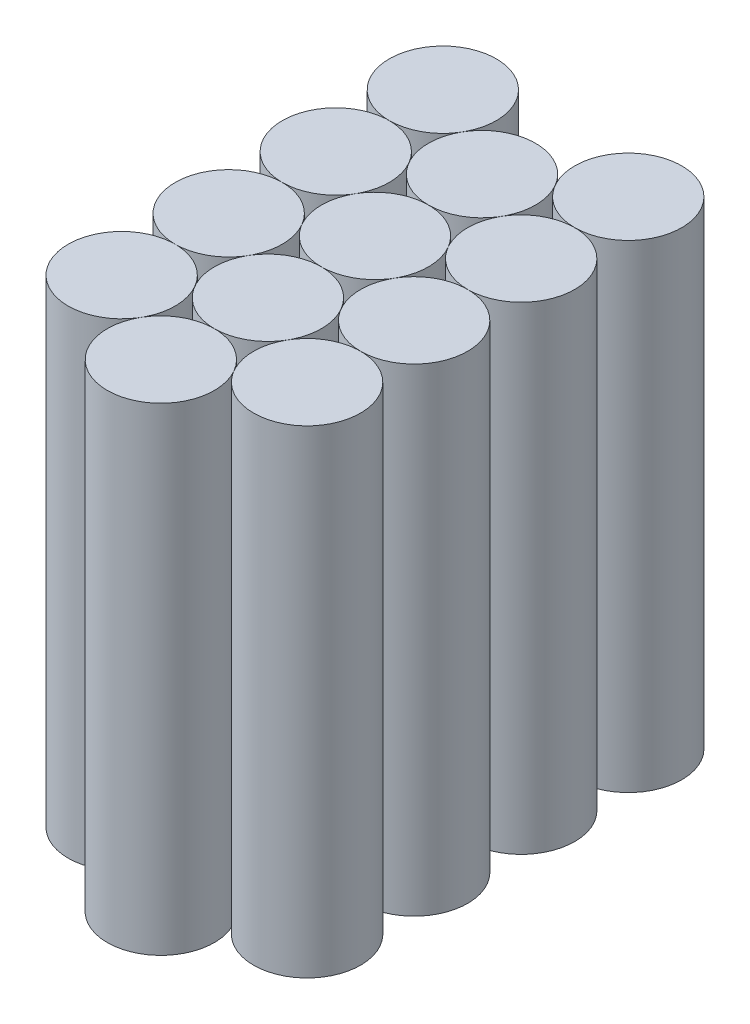
ISO-10303-21;
HEADER;
FILE_DESCRIPTION(('STEP AP214'),'2;1');
FILE_NAME('part.step','',(''),(''),'','','');
FILE_SCHEMA(('AUTOMOTIVE_DESIGN { 1 0 10303 214 1 1 1 1 }'));
ENDSEC;
DATA;
#1=APPLICATION_CONTEXT('core data for automotive mechanical design processes');
#2=APPLICATION_PROTOCOL_DEFINITION('international standard','automotive_design',2000,#1);
#3=PRODUCT_CONTEXT('',#1,'mechanical');
#4=PRODUCT('Part','Part','',(#3));
#5=PRODUCT_RELATED_PRODUCT_CATEGORY('part','',(#4));
#6=PRODUCT_DEFINITION_FORMATION('','',#4);
#7=PRODUCT_DEFINITION_CONTEXT('part definition',#1,'design');
#8=PRODUCT_DEFINITION('design','',#6,#7);
#9=PRODUCT_DEFINITION_SHAPE('','',#8);
#10=(LENGTH_UNIT() NAMED_UNIT(*) SI_UNIT(.MILLI.,.METRE.));
#11=(NAMED_UNIT(*) PLANE_ANGLE_UNIT() SI_UNIT($,.RADIAN.));
#12=(NAMED_UNIT(*) SI_UNIT($,.STERADIAN.) SOLID_ANGLE_UNIT());
#13=UNCERTAINTY_MEASURE_WITH_UNIT(LENGTH_MEASURE(1.E-05),#10,'distance_accuracy_value','');
#14=(GEOMETRIC_REPRESENTATION_CONTEXT(3) GLOBAL_UNCERTAINTY_ASSIGNED_CONTEXT((#13)) GLOBAL_UNIT_ASSIGNED_CONTEXT((#10,
#11,#12)) REPRESENTATION_CONTEXT('',''));
#15=CARTESIAN_POINT('',(0.,0.,0.));
#16=DIRECTION('',(0.,0.,1.));
#17=DIRECTION('',(1.,0.,0.));
#18=AXIS2_PLACEMENT_3D('',#15,#16,#17);
#19=CARTESIAN_POINT('',(12.9903810567666,67.,-22.5));
#20=DIRECTION('',(0.,-1.,0.));
#21=DIRECTION('',(0.,0.,-1.));
#22=AXIS2_PLACEMENT_3D('',#19,#20,#21);
#23=CYLINDRICAL_SURFACE('',#22,7.49999999999999);
#24=CARTESIAN_POINT('',(12.9903810567666,67.,-22.5));
#25=DIRECTION('',(0.,1.,0.));
#26=DIRECTION('',(0.,0.,1.));
#27=AXIS2_PLACEMENT_3D('',#24,#25,#26);
#28=CIRCLE('',#27,7.49999999999999);
#29=CARTESIAN_POINT('',(12.9903810567666,67.,-15.));
#30=VERTEX_POINT('',#29);
#31=EDGE_CURVE('E12',#30,#30,#28,.T.);
#32=ORIENTED_EDGE('',*,*,#31,.F.);
#33=EDGE_LOOP('',(#32));
#34=FACE_BOUND('',#33,.T.);
#35=CARTESIAN_POINT('',(12.9903810567666,0.,-22.5));
#36=DIRECTION('',(0.,1.,0.));
#37=DIRECTION('',(0.,0.,1.));
#38=AXIS2_PLACEMENT_3D('',#35,#36,#37);
#39=CIRCLE('',#38,7.49999999999999);
#40=CARTESIAN_POINT('',(12.9903810567666,0.,-15.));
#41=VERTEX_POINT('',#40);
#42=EDGE_CURVE('E138',#41,#41,#39,.T.);
#43=ORIENTED_EDGE('',*,*,#42,.T.);
#44=EDGE_LOOP('',(#43));
#45=FACE_BOUND('',#44,.T.);
#46=ADVANCED_FACE('F135',(#34,#45),#23,.T.);
#47=CARTESIAN_POINT('',(0.,67.,0.));
#48=DIRECTION('',(0.,1.,0.));
#49=DIRECTION('',(0.,0.,1.));
#50=AXIS2_PLACEMENT_3D('',#47,#48,#49);
#51=PLANE('',#50);
#52=ORIENTED_EDGE('',*,*,#31,.T.);
#53=EDGE_LOOP('',(#52));
#54=FACE_BOUND('',#53,.T.);
#55=ADVANCED_FACE('F150',(#54),#51,.T.);
#56=CARTESIAN_POINT('',(0.,0.,0.));
#57=DIRECTION('',(0.,1.,0.));
#58=DIRECTION('',(0.,0.,1.));
#59=AXIS2_PLACEMENT_3D('',#56,#57,#58);
#60=PLANE('',#59);
#61=ORIENTED_EDGE('',*,*,#42,.F.);
#62=EDGE_LOOP('',(#61));
#63=FACE_BOUND('',#62,.T.);
#64=ADVANCED_FACE('F148',(#63),#60,.F.);
#65=CLOSED_SHELL('',(#46,#55,#64));
#66=MANIFOLD_SOLID_BREP('B2',#65);
#67=CARTESIAN_POINT('',(12.9903810567666,67.,-37.5));
#68=DIRECTION('',(0.,-1.,0.));
#69=DIRECTION('',(0.,0.,-1.));
#70=AXIS2_PLACEMENT_3D('',#67,#68,#69);
#71=CYLINDRICAL_SURFACE('',#70,7.5);
#72=CARTESIAN_POINT('',(12.9903810567666,67.,-37.5));
#73=DIRECTION('',(0.,1.,0.));
#74=DIRECTION('',(0.,0.,1.));
#75=AXIS2_PLACEMENT_3D('',#72,#73,#74);
#76=CIRCLE('',#75,7.5);
#77=CARTESIAN_POINT('',(12.9903810567666,67.,-30.));
#78=VERTEX_POINT('',#77);
#79=EDGE_CURVE('E134',#78,#78,#76,.T.);
#80=ORIENTED_EDGE('',*,*,#79,.F.);
#81=EDGE_LOOP('',(#80));
#82=FACE_BOUND('',#81,.T.);
#83=CARTESIAN_POINT('',(12.9903810567666,0.,-37.5));
#84=DIRECTION('',(0.,1.,0.));
#85=DIRECTION('',(0.,0.,1.));
#86=AXIS2_PLACEMENT_3D('',#83,#84,#85);
#87=CIRCLE('',#86,7.5);
#88=CARTESIAN_POINT('',(12.9903810567666,0.,-30.));
#89=VERTEX_POINT('',#88);
#90=EDGE_CURVE('E186',#89,#89,#87,.T.);
#91=ORIENTED_EDGE('',*,*,#90,.T.);
#92=EDGE_LOOP('',(#91));
#93=FACE_BOUND('',#92,.T.);
#94=ADVANCED_FACE('F183',(#82,#93),#71,.T.);
#95=CARTESIAN_POINT('',(0.,67.,0.));
#96=DIRECTION('',(0.,1.,0.));
#97=DIRECTION('',(0.,0.,1.));
#98=AXIS2_PLACEMENT_3D('',#95,#96,#97);
#99=PLANE('',#98);
#100=ORIENTED_EDGE('',*,*,#79,.T.);
#101=EDGE_LOOP('',(#100));
#102=FACE_BOUND('',#101,.T.);
#103=ADVANCED_FACE('F198',(#102),#99,.T.);
#104=CARTESIAN_POINT('',(0.,0.,0.));
#105=DIRECTION('',(0.,1.,0.));
#106=DIRECTION('',(0.,0.,1.));
#107=AXIS2_PLACEMENT_3D('',#104,#105,#106);
#108=PLANE('',#107);
#109=ORIENTED_EDGE('',*,*,#90,.F.);
#110=EDGE_LOOP('',(#109));
#111=FACE_BOUND('',#110,.T.);
#112=ADVANCED_FACE('F196',(#111),#108,.F.);
#113=CLOSED_SHELL('',(#94,#103,#112));
#114=MANIFOLD_SOLID_BREP('B7',#113);
#115=CARTESIAN_POINT('',(12.9903810567666,67.,-52.5));
#116=DIRECTION('',(0.,-1.,0.));
#117=DIRECTION('',(0.,0.,-1.));
#118=AXIS2_PLACEMENT_3D('',#115,#116,#117);
#119=CYLINDRICAL_SURFACE('',#118,7.49999999999999);
#120=CARTESIAN_POINT('',(12.9903810567666,67.,-52.5));
#121=DIRECTION('',(0.,1.,0.));
#122=DIRECTION('',(0.,0.,1.));
#123=AXIS2_PLACEMENT_3D('',#120,#121,#122);
#124=CIRCLE('',#123,7.49999999999999);
#125=CARTESIAN_POINT('',(12.9903810567666,67.,-45.));
#126=VERTEX_POINT('',#125);
#127=EDGE_CURVE('E182',#126,#126,#124,.T.);
#128=ORIENTED_EDGE('',*,*,#127,.F.);
#129=EDGE_LOOP('',(#128));
#130=FACE_BOUND('',#129,.T.);
#131=CARTESIAN_POINT('',(12.9903810567666,0.,-52.5));
#132=DIRECTION('',(0.,1.,0.));
#133=DIRECTION('',(0.,0.,1.));
#134=AXIS2_PLACEMENT_3D('',#131,#132,#133);
#135=CIRCLE('',#134,7.49999999999999);
#136=CARTESIAN_POINT('',(12.9903810567666,0.,-45.));
#137=VERTEX_POINT('',#136);
#138=EDGE_CURVE('E234',#137,#137,#135,.T.);
#139=ORIENTED_EDGE('',*,*,#138,.T.);
#140=EDGE_LOOP('',(#139));
#141=FACE_BOUND('',#140,.T.);
#142=ADVANCED_FACE('F231',(#130,#141),#119,.T.);
#143=CARTESIAN_POINT('',(0.,67.,0.));
#144=DIRECTION('',(0.,1.,0.));
#145=DIRECTION('',(0.,0.,1.));
#146=AXIS2_PLACEMENT_3D('',#143,#144,#145);
#147=PLANE('',#146);
#148=ORIENTED_EDGE('',*,*,#127,.T.);
#149=EDGE_LOOP('',(#148));
#150=FACE_BOUND('',#149,.T.);
#151=ADVANCED_FACE('F246',(#150),#147,.T.);
#152=CARTESIAN_POINT('',(0.,0.,0.));
#153=DIRECTION('',(0.,1.,0.));
#154=DIRECTION('',(0.,0.,1.));
#155=AXIS2_PLACEMENT_3D('',#152,#153,#154);
#156=PLANE('',#155);
#157=ORIENTED_EDGE('',*,*,#138,.F.);
#158=EDGE_LOOP('',(#157));
#159=FACE_BOUND('',#158,.T.);
#160=ADVANCED_FACE('F244',(#159),#156,.F.);
#161=CLOSED_SHELL('',(#142,#151,#160));
#162=MANIFOLD_SOLID_BREP('B129',#161);
#163=CARTESIAN_POINT('',(0.,67.,-30.));
#164=DIRECTION('',(0.,-1.,0.));
#165=DIRECTION('',(0.,0.,-1.));
#166=AXIS2_PLACEMENT_3D('',#163,#164,#165);
#167=CYLINDRICAL_SURFACE('',#166,7.5);
#168=CARTESIAN_POINT('',(0.,67.,-30.));
#169=DIRECTION('',(0.,1.,0.));
#170=DIRECTION('',(0.,0.,1.));
#171=AXIS2_PLACEMENT_3D('',#168,#169,#170);
#172=CIRCLE('',#171,7.5);
#173=CARTESIAN_POINT('',(0.,67.,-22.5));
#174=VERTEX_POINT('',#173);
#175=EDGE_CURVE('E230',#174,#174,#172,.T.);
#176=ORIENTED_EDGE('',*,*,#175,.F.);
#177=EDGE_LOOP('',(#176));
#178=FACE_BOUND('',#177,.T.);
#179=CARTESIAN_POINT('',(0.,0.,-30.));
#180=DIRECTION('',(0.,1.,0.));
#181=DIRECTION('',(0.,0.,1.));
#182=AXIS2_PLACEMENT_3D('',#179,#180,#181);
#183=CIRCLE('',#182,7.5);
#184=CARTESIAN_POINT('',(0.,0.,-22.5));
#185=VERTEX_POINT('',#184);
#186=EDGE_CURVE('E282',#185,#185,#183,.T.);
#187=ORIENTED_EDGE('',*,*,#186,.T.);
#188=EDGE_LOOP('',(#187));
#189=FACE_BOUND('',#188,.T.);
#190=ADVANCED_FACE('F279',(#178,#189),#167,.T.);
#191=CARTESIAN_POINT('',(0.,67.,0.));
#192=DIRECTION('',(0.,1.,0.));
#193=DIRECTION('',(0.,0.,1.));
#194=AXIS2_PLACEMENT_3D('',#191,#192,#193);
#195=PLANE('',#194);
#196=ORIENTED_EDGE('',*,*,#175,.T.);
#197=EDGE_LOOP('',(#196));
#198=FACE_BOUND('',#197,.T.);
#199=ADVANCED_FACE('F294',(#198),#195,.T.);
#200=CARTESIAN_POINT('',(0.,0.,0.));
#201=DIRECTION('',(0.,1.,0.));
#202=DIRECTION('',(0.,0.,1.));
#203=AXIS2_PLACEMENT_3D('',#200,#201,#202);
#204=PLANE('',#203);
#205=ORIENTED_EDGE('',*,*,#186,.F.);
#206=EDGE_LOOP('',(#205));
#207=FACE_BOUND('',#206,.T.);
#208=ADVANCED_FACE('F292',(#207),#204,.F.);
#209=CLOSED_SHELL('',(#190,#199,#208));
#210=MANIFOLD_SOLID_BREP('B177',#209);
#211=CARTESIAN_POINT('',(0.,67.,-45.));
#212=DIRECTION('',(0.,-1.,0.));
#213=DIRECTION('',(0.,0.,-1.));
#214=AXIS2_PLACEMENT_3D('',#211,#212,#213);
#215=CYLINDRICAL_SURFACE('',#214,7.5);
#216=CARTESIAN_POINT('',(0.,67.,-45.));
#217=DIRECTION('',(0.,1.,0.));
#218=DIRECTION('',(0.,0.,1.));
#219=AXIS2_PLACEMENT_3D('',#216,#217,#218);
#220=CIRCLE('',#219,7.5);
#221=CARTESIAN_POINT('',(0.,67.,-37.5));
#222=VERTEX_POINT('',#221);
#223=EDGE_CURVE('E278',#222,#222,#220,.T.);
#224=ORIENTED_EDGE('',*,*,#223,.F.);
#225=EDGE_LOOP('',(#224));
#226=FACE_BOUND('',#225,.T.);
#227=CARTESIAN_POINT('',(0.,0.,-45.));
#228=DIRECTION('',(0.,1.,0.));
#229=DIRECTION('',(0.,0.,1.));
#230=AXIS2_PLACEMENT_3D('',#227,#228,#229);
#231=CIRCLE('',#230,7.5);
#232=CARTESIAN_POINT('',(0.,0.,-37.5));
#233=VERTEX_POINT('',#232);
#234=EDGE_CURVE('E330',#233,#233,#231,.T.);
#235=ORIENTED_EDGE('',*,*,#234,.T.);
#236=EDGE_LOOP('',(#235));
#237=FACE_BOUND('',#236,.T.);
#238=ADVANCED_FACE('F327',(#226,#237),#215,.T.);
#239=CARTESIAN_POINT('',(0.,67.,0.));
#240=DIRECTION('',(0.,1.,0.));
#241=DIRECTION('',(0.,0.,1.));
#242=AXIS2_PLACEMENT_3D('',#239,#240,#241);
#243=PLANE('',#242);
#244=ORIENTED_EDGE('',*,*,#223,.T.);
#245=EDGE_LOOP('',(#244));
#246=FACE_BOUND('',#245,.T.);
#247=ADVANCED_FACE('F342',(#246),#243,.T.);
#248=CARTESIAN_POINT('',(0.,0.,0.));
#249=DIRECTION('',(0.,1.,0.));
#250=DIRECTION('',(0.,0.,1.));
#251=AXIS2_PLACEMENT_3D('',#248,#249,#250);
#252=PLANE('',#251);
#253=ORIENTED_EDGE('',*,*,#234,.F.);
#254=EDGE_LOOP('',(#253));
#255=FACE_BOUND('',#254,.T.);
#256=ADVANCED_FACE('F340',(#255),#252,.F.);
#257=CLOSED_SHELL('',(#238,#247,#256));
#258=MANIFOLD_SOLID_BREP('B225',#257);
#259=CARTESIAN_POINT('',(-12.9903810567666,67.,-52.5));
#260=DIRECTION('',(0.,-1.,0.));
#261=DIRECTION('',(0.,0.,-1.));
#262=AXIS2_PLACEMENT_3D('',#259,#260,#261);
#263=CYLINDRICAL_SURFACE('',#262,7.49999999999999);
#264=CARTESIAN_POINT('',(-12.9903810567666,67.,-52.5));
#265=DIRECTION('',(0.,1.,0.));
#266=DIRECTION('',(0.,0.,1.));
#267=AXIS2_PLACEMENT_3D('',#264,#265,#266);
#268=CIRCLE('',#267,7.49999999999999);
#269=CARTESIAN_POINT('',(-12.9903810567666,67.,-45.));
#270=VERTEX_POINT('',#269);
#271=EDGE_CURVE('E326',#270,#270,#268,.T.);
#272=ORIENTED_EDGE('',*,*,#271,.F.);
#273=EDGE_LOOP('',(#272));
#274=FACE_BOUND('',#273,.T.);
#275=CARTESIAN_POINT('',(-12.9903810567666,0.,-52.5));
#276=DIRECTION('',(0.,1.,0.));
#277=DIRECTION('',(0.,0.,1.));
#278=AXIS2_PLACEMENT_3D('',#275,#276,#277);
#279=CIRCLE('',#278,7.49999999999999);
#280=CARTESIAN_POINT('',(-12.9903810567666,0.,-45.));
#281=VERTEX_POINT('',#280);
#282=EDGE_CURVE('E378',#281,#281,#279,.T.);
#283=ORIENTED_EDGE('',*,*,#282,.T.);
#284=EDGE_LOOP('',(#283));
#285=FACE_BOUND('',#284,.T.);
#286=ADVANCED_FACE('F375',(#274,#285),#263,.T.);
#287=CARTESIAN_POINT('',(0.,67.,0.));
#288=DIRECTION('',(0.,1.,0.));
#289=DIRECTION('',(0.,0.,1.));
#290=AXIS2_PLACEMENT_3D('',#287,#288,#289);
#291=PLANE('',#290);
#292=ORIENTED_EDGE('',*,*,#271,.T.);
#293=EDGE_LOOP('',(#292));
#294=FACE_BOUND('',#293,.T.);
#295=ADVANCED_FACE('F390',(#294),#291,.T.);
#296=CARTESIAN_POINT('',(0.,0.,0.));
#297=DIRECTION('',(0.,1.,0.));
#298=DIRECTION('',(0.,0.,1.));
#299=AXIS2_PLACEMENT_3D('',#296,#297,#298);
#300=PLANE('',#299);
#301=ORIENTED_EDGE('',*,*,#282,.F.);
#302=EDGE_LOOP('',(#301));
#303=FACE_BOUND('',#302,.T.);
#304=ADVANCED_FACE('F388',(#303),#300,.F.);
#305=CLOSED_SHELL('',(#286,#295,#304));
#306=MANIFOLD_SOLID_BREP('B273',#305);
#307=CARTESIAN_POINT('',(-12.9903810567666,67.,-37.5));
#308=DIRECTION('',(0.,-1.,0.));
#309=DIRECTION('',(0.,0.,-1.));
#310=AXIS2_PLACEMENT_3D('',#307,#308,#309);
#311=CYLINDRICAL_SURFACE('',#310,7.5);
#312=CARTESIAN_POINT('',(-12.9903810567666,67.,-37.5));
#313=DIRECTION('',(0.,1.,0.));
#314=DIRECTION('',(0.,0.,1.));
#315=AXIS2_PLACEMENT_3D('',#312,#313,#314);
#316=CIRCLE('',#315,7.5);
#317=CARTESIAN_POINT('',(-12.9903810567666,67.,-30.));
#318=VERTEX_POINT('',#317);
#319=EDGE_CURVE('E374',#318,#318,#316,.T.);
#320=ORIENTED_EDGE('',*,*,#319,.F.);
#321=EDGE_LOOP('',(#320));
#322=FACE_BOUND('',#321,.T.);
#323=CARTESIAN_POINT('',(-12.9903810567666,0.,-37.5));
#324=DIRECTION('',(0.,1.,0.));
#325=DIRECTION('',(0.,0.,1.));
#326=AXIS2_PLACEMENT_3D('',#323,#324,#325);
#327=CIRCLE('',#326,7.5);
#328=CARTESIAN_POINT('',(-12.9903810567666,0.,-30.));
#329=VERTEX_POINT('',#328);
#330=EDGE_CURVE('E426',#329,#329,#327,.T.);
#331=ORIENTED_EDGE('',*,*,#330,.T.);
#332=EDGE_LOOP('',(#331));
#333=FACE_BOUND('',#332,.T.);
#334=ADVANCED_FACE('F423',(#322,#333),#311,.T.);
#335=CARTESIAN_POINT('',(0.,67.,0.));
#336=DIRECTION('',(0.,1.,0.));
#337=DIRECTION('',(0.,0.,1.));
#338=AXIS2_PLACEMENT_3D('',#335,#336,#337);
#339=PLANE('',#338);
#340=ORIENTED_EDGE('',*,*,#319,.T.);
#341=EDGE_LOOP('',(#340));
#342=FACE_BOUND('',#341,.T.);
#343=ADVANCED_FACE('F438',(#342),#339,.T.);
#344=CARTESIAN_POINT('',(0.,0.,0.));
#345=DIRECTION('',(0.,1.,0.));
#346=DIRECTION('',(0.,0.,1.));
#347=AXIS2_PLACEMENT_3D('',#344,#345,#346);
#348=PLANE('',#347);
#349=ORIENTED_EDGE('',*,*,#330,.F.);
#350=EDGE_LOOP('',(#349));
#351=FACE_BOUND('',#350,.T.);
#352=ADVANCED_FACE('F436',(#351),#348,.F.);
#353=CLOSED_SHELL('',(#334,#343,#352));
#354=MANIFOLD_SOLID_BREP('B321',#353);
#355=CARTESIAN_POINT('',(-12.9903810567666,67.,-22.5));
#356=DIRECTION('',(0.,-1.,0.));
#357=DIRECTION('',(0.,0.,-1.));
#358=AXIS2_PLACEMENT_3D('',#355,#356,#357);
#359=CYLINDRICAL_SURFACE('',#358,7.5);
#360=CARTESIAN_POINT('',(-12.9903810567666,67.,-22.5));
#361=DIRECTION('',(0.,1.,0.));
#362=DIRECTION('',(0.,0.,1.));
#363=AXIS2_PLACEMENT_3D('',#360,#361,#362);
#364=CIRCLE('',#363,7.5);
#365=CARTESIAN_POINT('',(-12.9903810567666,67.,-15.));
#366=VERTEX_POINT('',#365);
#367=EDGE_CURVE('E422',#366,#366,#364,.T.);
#368=ORIENTED_EDGE('',*,*,#367,.F.);
#369=EDGE_LOOP('',(#368));
#370=FACE_BOUND('',#369,.T.);
#371=CARTESIAN_POINT('',(-12.9903810567666,0.,-22.5));
#372=DIRECTION('',(0.,1.,0.));
#373=DIRECTION('',(0.,0.,1.));
#374=AXIS2_PLACEMENT_3D('',#371,#372,#373);
#375=CIRCLE('',#374,7.5);
#376=CARTESIAN_POINT('',(-12.9903810567666,0.,-15.));
#377=VERTEX_POINT('',#376);
#378=EDGE_CURVE('E474',#377,#377,#375,.T.);
#379=ORIENTED_EDGE('',*,*,#378,.T.);
#380=EDGE_LOOP('',(#379));
#381=FACE_BOUND('',#380,.T.);
#382=ADVANCED_FACE('F471',(#370,#381),#359,.T.);
#383=CARTESIAN_POINT('',(0.,67.,0.));
#384=DIRECTION('',(0.,1.,0.));
#385=DIRECTION('',(0.,0.,1.));
#386=AXIS2_PLACEMENT_3D('',#383,#384,#385);
#387=PLANE('',#386);
#388=ORIENTED_EDGE('',*,*,#367,.T.);
#389=EDGE_LOOP('',(#388));
#390=FACE_BOUND('',#389,.T.);
#391=ADVANCED_FACE('F486',(#390),#387,.T.);
#392=CARTESIAN_POINT('',(0.,0.,0.));
#393=DIRECTION('',(0.,1.,0.));
#394=DIRECTION('',(0.,0.,1.));
#395=AXIS2_PLACEMENT_3D('',#392,#393,#394);
#396=PLANE('',#395);
#397=ORIENTED_EDGE('',*,*,#378,.F.);
#398=EDGE_LOOP('',(#397));
#399=FACE_BOUND('',#398,.T.);
#400=ADVANCED_FACE('F484',(#399),#396,.F.);
#401=CLOSED_SHELL('',(#382,#391,#400));
#402=MANIFOLD_SOLID_BREP('B369',#401);
#403=CARTESIAN_POINT('',(-12.9903810567666,67.,-7.5));
#404=DIRECTION('',(0.,-1.,0.));
#405=DIRECTION('',(0.,0.,-1.));
#406=AXIS2_PLACEMENT_3D('',#403,#404,#405);
#407=CYLINDRICAL_SURFACE('',#406,7.5);
#408=CARTESIAN_POINT('',(-12.9903810567666,67.,-7.5));
#409=DIRECTION('',(0.,1.,0.));
#410=DIRECTION('',(0.,0.,1.));
#411=AXIS2_PLACEMENT_3D('',#408,#409,#410);
#412=CIRCLE('',#411,7.5);
#413=CARTESIAN_POINT('',(-12.9903810567666,67.,0.));
#414=VERTEX_POINT('',#413);
#415=EDGE_CURVE('E470',#414,#414,#412,.T.);
#416=ORIENTED_EDGE('',*,*,#415,.F.);
#417=EDGE_LOOP('',(#416));
#418=FACE_BOUND('',#417,.T.);
#419=CARTESIAN_POINT('',(-12.9903810567666,0.,-7.5));
#420=DIRECTION('',(0.,1.,0.));
#421=DIRECTION('',(0.,0.,1.));
#422=AXIS2_PLACEMENT_3D('',#419,#420,#421);
#423=CIRCLE('',#422,7.5);
#424=CARTESIAN_POINT('',(-12.9903810567666,0.,0.));
#425=VERTEX_POINT('',#424);
#426=EDGE_CURVE('E522',#425,#425,#423,.T.);
#427=ORIENTED_EDGE('',*,*,#426,.T.);
#428=EDGE_LOOP('',(#427));
#429=FACE_BOUND('',#428,.T.);
#430=ADVANCED_FACE('F519',(#418,#429),#407,.T.);
#431=CARTESIAN_POINT('',(0.,67.,0.));
#432=DIRECTION('',(0.,1.,0.));
#433=DIRECTION('',(0.,0.,1.));
#434=AXIS2_PLACEMENT_3D('',#431,#432,#433);
#435=PLANE('',#434);
#436=ORIENTED_EDGE('',*,*,#415,.T.);
#437=EDGE_LOOP('',(#436));
#438=FACE_BOUND('',#437,.T.);
#439=ADVANCED_FACE('F534',(#438),#435,.T.);
#440=CARTESIAN_POINT('',(0.,0.,0.));
#441=DIRECTION('',(0.,1.,0.));
#442=DIRECTION('',(0.,0.,1.));
#443=AXIS2_PLACEMENT_3D('',#440,#441,#442);
#444=PLANE('',#443);
#445=ORIENTED_EDGE('',*,*,#426,.F.);
#446=EDGE_LOOP('',(#445));
#447=FACE_BOUND('',#446,.T.);
#448=ADVANCED_FACE('F532',(#447),#444,.F.);
#449=CLOSED_SHELL('',(#430,#439,#448));
#450=MANIFOLD_SOLID_BREP('B417',#449);
#451=CARTESIAN_POINT('',(0.,67.,-15.));
#452=DIRECTION('',(0.,-1.,0.));
#453=DIRECTION('',(0.,0.,-1.));
#454=AXIS2_PLACEMENT_3D('',#451,#452,#453);
#455=CYLINDRICAL_SURFACE('',#454,7.5);
#456=CARTESIAN_POINT('',(0.,67.,-15.));
#457=DIRECTION('',(0.,1.,0.));
#458=DIRECTION('',(0.,0.,1.));
#459=AXIS2_PLACEMENT_3D('',#456,#457,#458);
#460=CIRCLE('',#459,7.5);
#461=CARTESIAN_POINT('',(0.,67.,-7.5));
#462=VERTEX_POINT('',#461);
#463=EDGE_CURVE('E518',#462,#462,#460,.T.);
#464=ORIENTED_EDGE('',*,*,#463,.F.);
#465=EDGE_LOOP('',(#464));
#466=FACE_BOUND('',#465,.T.);
#467=CARTESIAN_POINT('',(0.,0.,-15.));
#468=DIRECTION('',(0.,1.,0.));
#469=DIRECTION('',(0.,0.,1.));
#470=AXIS2_PLACEMENT_3D('',#467,#468,#469);
#471=CIRCLE('',#470,7.5);
#472=CARTESIAN_POINT('',(0.,0.,-7.5));
#473=VERTEX_POINT('',#472);
#474=EDGE_CURVE('E570',#473,#473,#471,.T.);
#475=ORIENTED_EDGE('',*,*,#474,.T.);
#476=EDGE_LOOP('',(#475));
#477=FACE_BOUND('',#476,.T.);
#478=ADVANCED_FACE('F567',(#466,#477),#455,.T.);
#479=CARTESIAN_POINT('',(0.,67.,0.));
#480=DIRECTION('',(0.,1.,0.));
#481=DIRECTION('',(0.,0.,1.));
#482=AXIS2_PLACEMENT_3D('',#479,#480,#481);
#483=PLANE('',#482);
#484=ORIENTED_EDGE('',*,*,#463,.T.);
#485=EDGE_LOOP('',(#484));
#486=FACE_BOUND('',#485,.T.);
#487=ADVANCED_FACE('F582',(#486),#483,.T.);
#488=CARTESIAN_POINT('',(0.,0.,0.));
#489=DIRECTION('',(0.,1.,0.));
#490=DIRECTION('',(0.,0.,1.));
#491=AXIS2_PLACEMENT_3D('',#488,#489,#490);
#492=PLANE('',#491);
#493=ORIENTED_EDGE('',*,*,#474,.F.);
#494=EDGE_LOOP('',(#493));
#495=FACE_BOUND('',#494,.T.);
#496=ADVANCED_FACE('F580',(#495),#492,.F.);
#497=CLOSED_SHELL('',(#478,#487,#496));
#498=MANIFOLD_SOLID_BREP('B465',#497);
#499=CARTESIAN_POINT('',(0.,67.,0.));
#500=DIRECTION('',(0.,-1.,0.));
#501=DIRECTION('',(0.,0.,-1.));
#502=AXIS2_PLACEMENT_3D('',#499,#500,#501);
#503=CYLINDRICAL_SURFACE('',#502,7.5);
#504=CARTESIAN_POINT('',(0.,67.,0.));
#505=DIRECTION('',(0.,1.,0.));
#506=DIRECTION('',(0.,0.,1.));
#507=AXIS2_PLACEMENT_3D('',#504,#505,#506);
#508=CIRCLE('',#507,7.5);
#509=CARTESIAN_POINT('',(0.,67.,7.5));
#510=VERTEX_POINT('',#509);
#511=EDGE_CURVE('E566',#510,#510,#508,.T.);
#512=ORIENTED_EDGE('',*,*,#511,.F.);
#513=EDGE_LOOP('',(#512));
#514=FACE_BOUND('',#513,.T.);
#515=CARTESIAN_POINT('',(0.,0.,0.));
#516=DIRECTION('',(0.,1.,0.));
#517=DIRECTION('',(0.,0.,1.));
#518=AXIS2_PLACEMENT_3D('',#515,#516,#517);
#519=CIRCLE('',#518,7.5);
#520=CARTESIAN_POINT('',(0.,0.,7.5));
#521=VERTEX_POINT('',#520);
#522=EDGE_CURVE('E617',#521,#521,#519,.T.);
#523=ORIENTED_EDGE('',*,*,#522,.T.);
#524=EDGE_LOOP('',(#523));
#525=FACE_BOUND('',#524,.T.);
#526=ADVANCED_FACE('F614',(#514,#525),#503,.T.);
#527=CARTESIAN_POINT('',(0.,67.,0.));
#528=DIRECTION('',(0.,1.,0.));
#529=DIRECTION('',(0.,0.,1.));
#530=AXIS2_PLACEMENT_3D('',#527,#528,#529);
#531=PLANE('',#530);
#532=ORIENTED_EDGE('',*,*,#511,.T.);
#533=EDGE_LOOP('',(#532));
#534=FACE_BOUND('',#533,.T.);
#535=ADVANCED_FACE('F629',(#534),#531,.T.);
#536=CARTESIAN_POINT('',(0.,0.,0.));
#537=DIRECTION('',(0.,1.,0.));
#538=DIRECTION('',(0.,0.,1.));
#539=AXIS2_PLACEMENT_3D('',#536,#537,#538);
#540=PLANE('',#539);
#541=ORIENTED_EDGE('',*,*,#522,.F.);
#542=EDGE_LOOP('',(#541));
#543=FACE_BOUND('',#542,.T.);
#544=ADVANCED_FACE('F627',(#543),#540,.F.);
#545=CLOSED_SHELL('',(#526,#535,#544));
#546=MANIFOLD_SOLID_BREP('B513',#545);
#547=CARTESIAN_POINT('',(12.9903810567666,67.,-7.5));
#548=DIRECTION('',(0.,-1.,0.));
#549=DIRECTION('',(0.,0.,-1.));
#550=AXIS2_PLACEMENT_3D('',#547,#548,#549);
#551=CYLINDRICAL_SURFACE('',#550,7.49999999999999);
#552=CARTESIAN_POINT('',(12.9903810567666,67.,-7.5));
#553=DIRECTION('',(0.,1.,0.));
#554=DIRECTION('',(0.,0.,1.));
#555=AXIS2_PLACEMENT_3D('',#552,#553,#554);
#556=CIRCLE('',#555,7.49999999999999);
#557=CARTESIAN_POINT('',(12.9903810567666,67.,0.));
#558=VERTEX_POINT('',#557);
#559=EDGE_CURVE('E613',#558,#558,#556,.T.);
#560=ORIENTED_EDGE('',*,*,#559,.F.);
#561=EDGE_LOOP('',(#560));
#562=FACE_BOUND('',#561,.T.);
#563=CARTESIAN_POINT('',(12.9903810567666,0.,-7.5));
#564=DIRECTION('',(0.,1.,0.));
#565=DIRECTION('',(0.,0.,1.));
#566=AXIS2_PLACEMENT_3D('',#563,#564,#565);
#567=CIRCLE('',#566,7.49999999999999);
#568=CARTESIAN_POINT('',(12.9903810567666,0.,0.));
#569=VERTEX_POINT('',#568);
#570=EDGE_CURVE('E657',#569,#569,#567,.T.);
#571=ORIENTED_EDGE('',*,*,#570,.T.);
#572=EDGE_LOOP('',(#571));
#573=FACE_BOUND('',#572,.T.);
#574=ADVANCED_FACE('F654',(#562,#573),#551,.T.);
#575=CARTESIAN_POINT('',(0.,67.,0.));
#576=DIRECTION('',(0.,1.,0.));
#577=DIRECTION('',(0.,0.,1.));
#578=AXIS2_PLACEMENT_3D('',#575,#576,#577);
#579=PLANE('',#578);
#580=ORIENTED_EDGE('',*,*,#559,.T.);
#581=EDGE_LOOP('',(#580));
#582=FACE_BOUND('',#581,.T.);
#583=ADVANCED_FACE('F669',(#582),#579,.T.);
#584=CARTESIAN_POINT('',(0.,0.,0.));
#585=DIRECTION('',(0.,1.,0.));
#586=DIRECTION('',(0.,0.,1.));
#587=AXIS2_PLACEMENT_3D('',#584,#585,#586);
#588=PLANE('',#587);
#589=ORIENTED_EDGE('',*,*,#570,.F.);
#590=EDGE_LOOP('',(#589));
#591=FACE_BOUND('',#590,.T.);
#592=ADVANCED_FACE('F667',(#591),#588,.F.);
#593=CLOSED_SHELL('',(#574,#583,#592));
#594=MANIFOLD_SOLID_BREP('B561',#593);
#595=ADVANCED_BREP_SHAPE_REPRESENTATION('',(#18,#66,#114,#162,#210,#258,#306,#354,#402,#450,
#498,#546,#594),#14);
#596=SHAPE_DEFINITION_REPRESENTATION(#9,#595);
ENDSEC;
END-ISO-10303-21;
